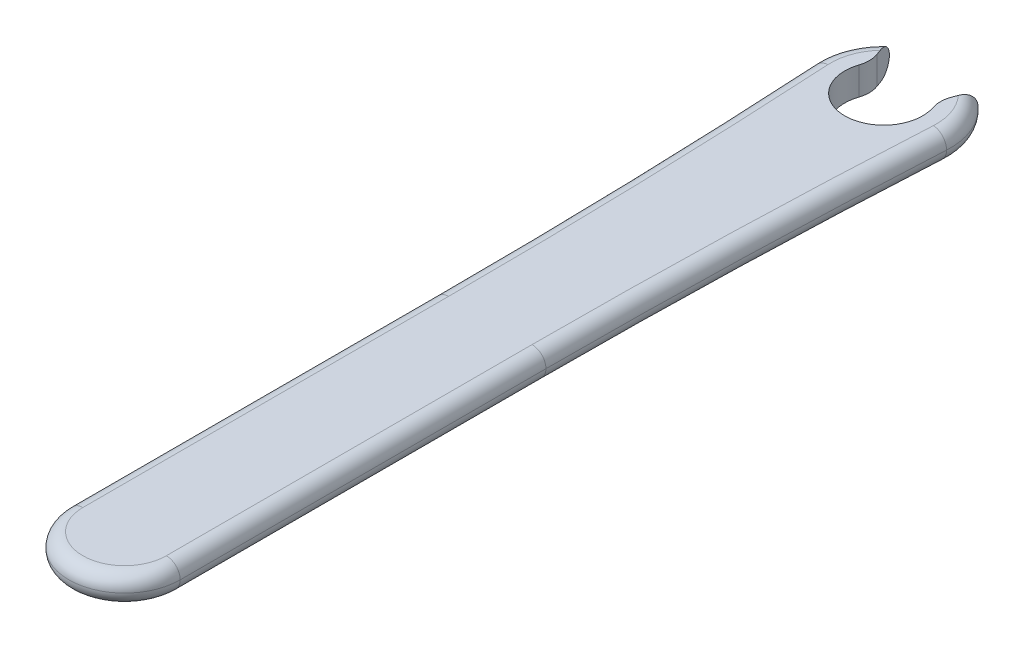
ISO-10303-21;
HEADER;
FILE_DESCRIPTION(('STEP AP214'),'2;1');
FILE_NAME('part.step','',(''),(''),'','','');
FILE_SCHEMA(('AUTOMOTIVE_DESIGN { 1 0 10303 214 1 1 1 1 }'));
ENDSEC;
DATA;
#1=APPLICATION_CONTEXT('core data for automotive mechanical design processes');
#2=APPLICATION_PROTOCOL_DEFINITION('international standard','automotive_design',2000,#1);
#3=PRODUCT_CONTEXT('',#1,'mechanical');
#4=PRODUCT('Part','Part','',(#3));
#5=PRODUCT_RELATED_PRODUCT_CATEGORY('part','',(#4));
#6=PRODUCT_DEFINITION_FORMATION('','',#4);
#7=PRODUCT_DEFINITION_CONTEXT('part definition',#1,'design');
#8=PRODUCT_DEFINITION('design','',#6,#7);
#9=PRODUCT_DEFINITION_SHAPE('','',#8);
#10=(LENGTH_UNIT() NAMED_UNIT(*) SI_UNIT(.MILLI.,.METRE.));
#11=(NAMED_UNIT(*) PLANE_ANGLE_UNIT() SI_UNIT($,.RADIAN.));
#12=(NAMED_UNIT(*) SI_UNIT($,.STERADIAN.) SOLID_ANGLE_UNIT());
#13=UNCERTAINTY_MEASURE_WITH_UNIT(LENGTH_MEASURE(1.E-05),#10,'distance_accuracy_value','');
#14=(GEOMETRIC_REPRESENTATION_CONTEXT(3) GLOBAL_UNCERTAINTY_ASSIGNED_CONTEXT((#13)) GLOBAL_UNIT_ASSIGNED_CONTEXT((#10,
#11,#12)) REPRESENTATION_CONTEXT('',''));
#15=CARTESIAN_POINT('',(0.,0.,0.));
#16=DIRECTION('',(0.,0.,1.));
#17=DIRECTION('',(1.,0.,0.));
#18=AXIS2_PLACEMENT_3D('',#15,#16,#17);
#19=CARTESIAN_POINT('',(-39.696999348701,5.,-14.4485261526121));
#20=DIRECTION('',(-0.939692620785908,0.,-0.34202014332567));
#21=DIRECTION('',(-0.34202014332567,0.,0.939692620785908));
#22=AXIS2_PLACEMENT_3D('',#19,#20,#21);
#23=PLANE('',#22);
#24=DIRECTION('',(0.34202014332567,0.,-0.939692620785908));
#25=VECTOR('',#24,1.);
#26=CARTESIAN_POINT('',(-39.696999348701,0.,-14.4485261526121));
#27=LINE('',#26,#25);
#28=CARTESIAN_POINT('',(6.68838596375788,0.,-141.891324891294));
#29=VERTEX_POINT('',#28);
#30=CARTESIAN_POINT('',(7.01811954357422,0.,-142.797260456276));
#31=VERTEX_POINT('',#30);
#32=EDGE_CURVE('E155',#29,#31,#27,.T.);
#33=ORIENTED_EDGE('',*,*,#32,.F.);
#34=DIRECTION('',(0.,-1.,0.));
#35=VECTOR('',#34,1.);
#36=CARTESIAN_POINT('',(6.68838596375787,5.,-141.891324891294));
#37=LINE('',#36,#35);
#38=CARTESIAN_POINT('',(6.68838596375788,5.,-141.891324891294));
#39=VERTEX_POINT('',#38);
#40=EDGE_CURVE('E64',#29,#39,#37,.F.);
#41=ORIENTED_EDGE('',*,*,#40,.T.);
#42=DIRECTION('',(0.34202014332567,0.,-0.939692620785908));
#43=VECTOR('',#42,1.);
#44=CARTESIAN_POINT('',(-39.696999348701,5.,-14.4485261526121));
#45=LINE('',#44,#43);
#46=CARTESIAN_POINT('',(7.01811954357422,5.,-142.797260456276));
#47=VERTEX_POINT('',#46);
#48=EDGE_CURVE('E318',#39,#47,#45,.T.);
#49=ORIENTED_EDGE('',*,*,#48,.T.);
#50=CARTESIAN_POINT('',(7.01811954357419,5.,-142.797260456276));
#51=CARTESIAN_POINT('',(7.04691442228125,4.99999569487418,-142.876373735319));
#52=CARTESIAN_POINT('',(7.07569893168847,4.99665912763034,-142.955458524946));
#53=CARTESIAN_POINT('',(7.13309334301084,4.98319356858276,-143.113148374057));
#54=CARTESIAN_POINT('',(7.16170316351006,4.97306162219831,-143.191753209853));
#55=CARTESIAN_POINT('',(7.24717008681841,4.93220456844502,-143.426571651753));
#56=CARTESIAN_POINT('',(7.30349226458079,4.89101665324073,-143.581315563369));
#57=CARTESIAN_POINT('',(7.41298594618291,4.78041147476569,-143.882146981144));
#58=CARTESIAN_POINT('',(7.46614759123599,4.71091069773193,-144.028207400509));
#59=CARTESIAN_POINT('',(7.56712675796152,4.54453843727452,-144.305645380922));
#60=CARTESIAN_POINT('',(7.61495425092782,4.44771925946431,-144.437050337876));
#61=CARTESIAN_POINT('',(7.69958654783228,4.23806297979748,-144.669575662578));
#62=CARTESIAN_POINT('',(7.73698018128248,4.12725881240472,-144.772313826114));
#63=CARTESIAN_POINT('',(7.80413600309858,3.88724046736428,-144.956822930138));
#64=CARTESIAN_POINT('',(7.83389778084395,3.758025299722,-145.038592742457));
#65=CARTESIAN_POINT('',(7.88218130864503,3.49743648708916,-145.171250644822));
#66=CARTESIAN_POINT('',(7.90146398906665,3.3672629391275,-145.224229373867));
#67=CARTESIAN_POINT('',(7.93174599027238,3.09904379413317,-145.307428488395));
#68=CARTESIAN_POINT('',(7.94276063746545,2.9610132752856,-145.337690982842));
#69=CARTESIAN_POINT('',(7.9519631461084,2.76811862292543,-145.36297466754));
#70=CARTESIAN_POINT('',(7.95387094574782,2.71460329032933,-145.368216303971));
#71=CARTESIAN_POINT('',(7.95641294171998,2.60740099332147,-145.375200380504));
#72=CARTESIAN_POINT('',(7.95704917916841,2.5537144427497,-145.376948428527));
#73=CARTESIAN_POINT('',(7.95705021219238,2.50000000000004,-145.376951266737));
#74=B_SPLINE_CURVE_WITH_KNOTS('',3,(#50,#51,#52,#53,#54,#55,#56,#57,#58,#59,#60,#61,#62,#63,#64,
#65,#66,#67,#68,#69,#70,#71,#72,#73),.UNSPECIFIED.,.F.,.F.,(4,2,2,2,2,2,2,2,2,2,2,4),(0.,
0.252438653894688,0.504987137469356,1.01157805277916,1.51967419323459,2.02680402485596,
2.4912678586387,2.9557566769597,3.37919345375437,3.80184335642917,3.96315812857803,
4.12421374908903),.UNSPECIFIED.);
#75=CARTESIAN_POINT('',(7.95705021219229,2.5,-145.376951266737));
#76=VERTEX_POINT('',#75);
#77=EDGE_CURVE('E168',#47,#76,#74,.T.);
#78=ORIENTED_EDGE('',*,*,#77,.T.);
#79=CARTESIAN_POINT('',(7.95705021219229,2.5,-145.376951266737));
#80=CARTESIAN_POINT('',(7.9570533103432,2.43345665852213,-145.376959778837));
#81=CARTESIAN_POINT('',(7.95607338441053,2.36691766148827,-145.374267454464));
#82=CARTESIAN_POINT('',(7.95217128845519,2.23433878829222,-145.363546533938));
#83=CARTESIAN_POINT('',(7.94924943331622,2.16829883296598,-145.355518802921));
#84=CARTESIAN_POINT('',(7.94149655558822,2.03734345523818,-145.334217946428));
#85=CARTESIAN_POINT('',(7.93667011807542,1.97242572012709,-145.320957418345));
#86=CARTESIAN_POINT('',(7.92515883166769,1.84403263747157,-145.289330418871));
#87=CARTESIAN_POINT('',(7.91847396602208,1.7805573029336,-145.270963901457));
#88=CARTESIAN_POINT('',(7.89571655259378,1.59297083259672,-145.208438421938));
#89=CARTESIAN_POINT('',(7.87693344901036,1.47157016191326,-145.156832268975));
#90=CARTESIAN_POINT('',(7.83283035507492,1.23946394539727,-145.035660014259));
#91=CARTESIAN_POINT('',(7.80750843467638,1.12876157063528,-144.966088609747));
#92=CARTESIAN_POINT('',(7.75047687198446,0.917999599725764,-144.809395679055));
#93=CARTESIAN_POINT('',(7.71862610363177,0.818266658905984,-144.721886412214));
#94=CARTESIAN_POINT('',(7.6499700954092,0.634711468903092,-144.533255579912));
#95=CARTESIAN_POINT('',(7.61316438482801,0.550890733178659,-144.432132721183));
#96=CARTESIAN_POINT('',(7.53311335453101,0.395559375438975,-144.212194323038));
#97=CARTESIAN_POINT('',(7.48960431995705,0.325212182545565,-144.092654233004));
#98=CARTESIAN_POINT('',(7.39938457619261,0.204885266884529,-143.844777524222));
#99=CARTESIAN_POINT('',(7.35267087503518,0.154924888629373,-143.716432685113));
#100=CARTESIAN_POINT('',(7.25832336810969,0.0765469630457412,-143.457215040253));
#101=CARTESIAN_POINT('',(7.21073457241573,0.0476658042627298,-143.326465898665));
#102=CARTESIAN_POINT('',(7.13876683452261,0.0189656723391909,-143.128736163875));
#103=CARTESIAN_POINT('',(7.11470134648222,0.0118357607807873,-143.062616778896));
#104=CARTESIAN_POINT('',(7.06646580784185,0.00235445068809157,-142.930090725666));
#105=CARTESIAN_POINT('',(7.04229578303531,1.93403959648804E-06,-142.863684128282));
#106=CARTESIAN_POINT('',(7.0181195435742,0.,-142.797260456276));
#107=B_SPLINE_CURVE_WITH_KNOTS('',3,(#79,#80,#81,#82,#83,#84,#85,#86,#87,#88,#89,#90,#91,#92,
#93,#94,#95,#96,#97,#98,#99,#100,#101,#102,#103,#104,#105,#106),.UNSPECIFIED.,.F.,.F.,(4,2,2,2,
2,2,2,2,2,2,2,2,2,4),(0.,0.19956086314104,0.399089375392354,0.598140446346242,0.797193311476509,
1.19491090210467,1.59274602051257,2.00031467964391,2.40792208448062,2.84218408853627,
3.27685719954437,3.70165571470379,3.91368650407941,4.12566766348372),.UNSPECIFIED.);
#108=EDGE_CURVE('E166',#76,#31,#107,.T.);
#109=ORIENTED_EDGE('',*,*,#108,.T.);
#110=EDGE_LOOP('',(#33,#41,#49,#78,#109));
#111=FACE_BOUND('',#110,.T.);
#112=ADVANCED_FACE('F41',(#111),#23,.T.);
#113=CARTESIAN_POINT('',(0.,5.,-136.394448724536));
#114=DIRECTION('',(0.,-1.,0.));
#115=DIRECTION('',(0.,0.,-1.));
#116=AXIS2_PLACEMENT_3D('',#113,#114,#115);
#117=CYLINDRICAL_SURFACE('',#116,7.);
#118=CARTESIAN_POINT('',(0.,5.,-136.394448724536));
#119=DIRECTION('',(0.,1.,0.));
#120=DIRECTION('',(0.,0.,1.));
#121=AXIS2_PLACEMENT_3D('',#118,#119,#120);
#122=CIRCLE('',#121,7.);
#123=CARTESIAN_POINT('',(-6.64232862281765,5.,-138.603401070445));
#124=VERTEX_POINT('',#123);
#125=CARTESIAN_POINT('',(6.64232862281765,5.,-138.603401070445));
#126=VERTEX_POINT('',#125);
#127=EDGE_CURVE('E317',#124,#126,#122,.T.);
#128=ORIENTED_EDGE('',*,*,#127,.T.);
#129=DIRECTION('',(0.,-1.,0.));
#130=VECTOR('',#129,1.);
#131=CARTESIAN_POINT('',(6.64232862281765,5.,-138.603401070445));
#132=LINE('',#131,#130);
#133=CARTESIAN_POINT('',(6.64232862281765,0.,-138.603401070445));
#134=VERTEX_POINT('',#133);
#135=EDGE_CURVE('E308',#126,#134,#132,.T.);
#136=ORIENTED_EDGE('',*,*,#135,.T.);
#137=CARTESIAN_POINT('',(0.,0.,-136.394448724536));
#138=DIRECTION('',(0.,1.,0.));
#139=DIRECTION('',(0.,0.,1.));
#140=AXIS2_PLACEMENT_3D('',#137,#138,#139);
#141=CIRCLE('',#140,7.);
#142=CARTESIAN_POINT('',(-6.64232862281765,0.,-138.603401070445));
#143=VERTEX_POINT('',#142);
#144=EDGE_CURVE('E162',#143,#134,#141,.T.);
#145=ORIENTED_EDGE('',*,*,#144,.F.);
#146=DIRECTION('',(0.,-1.,0.));
#147=VECTOR('',#146,1.);
#148=CARTESIAN_POINT('',(-6.64232862281765,5.,-138.603401070445));
#149=LINE('',#148,#147);
#150=EDGE_CURVE('E306',#143,#124,#149,.F.);
#151=ORIENTED_EDGE('',*,*,#150,.T.);
#152=EDGE_LOOP('',(#128,#136,#145,#151));
#153=FACE_BOUND('',#152,.T.);
#154=ADVANCED_FACE('F223',(#153),#117,.F.);
#155=CARTESIAN_POINT('',(39.696999348701,5.,-14.448526152612));
#156=DIRECTION('',(-0.939692620785908,0.,0.34202014332567));
#157=DIRECTION('',(0.34202014332567,0.,0.939692620785908));
#158=AXIS2_PLACEMENT_3D('',#155,#156,#157);
#159=PLANE('',#158);
#160=DIRECTION('',(-0.34202014332567,0.,-0.939692620785908));
#161=VECTOR('',#160,1.);
#162=CARTESIAN_POINT('',(39.696999348701,5.,-14.448526152612));
#163=LINE('',#162,#161);
#164=CARTESIAN_POINT('',(-6.68838596375788,5.,-141.891324891294));
#165=VERTEX_POINT('',#164);
#166=CARTESIAN_POINT('',(-7.0181195435742,5.,-142.797260456276));
#167=VERTEX_POINT('',#166);
#168=EDGE_CURVE('E323',#165,#167,#163,.T.);
#169=ORIENTED_EDGE('',*,*,#168,.F.);
#170=DIRECTION('',(0.,1.,0.));
#171=VECTOR('',#170,1.);
#172=CARTESIAN_POINT('',(-6.68838596375787,0.,-141.891324891294));
#173=LINE('',#172,#171);
#174=CARTESIAN_POINT('',(-6.68838596375788,0.,-141.891324891294));
#175=VERTEX_POINT('',#174);
#176=EDGE_CURVE('E11',#165,#175,#173,.F.);
#177=ORIENTED_EDGE('',*,*,#176,.T.);
#178=DIRECTION('',(-0.34202014332567,0.,-0.939692620785908));
#179=VECTOR('',#178,1.);
#180=CARTESIAN_POINT('',(39.696999348701,0.,-14.448526152612));
#181=LINE('',#180,#179);
#182=CARTESIAN_POINT('',(-7.0181195435742,0.,-142.797260456276));
#183=VERTEX_POINT('',#182);
#184=EDGE_CURVE('E391',#175,#183,#181,.T.);
#185=ORIENTED_EDGE('',*,*,#184,.T.);
#186=CARTESIAN_POINT('',(-7.01811954357421,0.,-142.797260456276));
#187=CARTESIAN_POINT('',(-7.04691442228126,4.30512581740736E-06,-142.876373735319));
#188=CARTESIAN_POINT('',(-7.07569893168848,0.00334087236966369,-142.955458524945));
#189=CARTESIAN_POINT('',(-7.13309334301084,0.0168064314172379,-143.113148374057));
#190=CARTESIAN_POINT('',(-7.16170316351006,0.0269383778016891,-143.191753209853));
#191=CARTESIAN_POINT('',(-7.24717008681841,0.067795431554977,-143.426571651753));
#192=CARTESIAN_POINT('',(-7.30349226458079,0.108983346759271,-143.581315563369));
#193=CARTESIAN_POINT('',(-7.41298594618292,0.219588525234315,-143.882146981144));
#194=CARTESIAN_POINT('',(-7.46614759123599,0.289089302268081,-144.028207400509));
#195=CARTESIAN_POINT('',(-7.56712675796153,0.455461562725495,-144.305645380922));
#196=CARTESIAN_POINT('',(-7.61495425092784,0.552280740535714,-144.437050337876));
#197=CARTESIAN_POINT('',(-7.6995865478323,0.761937020202538,-144.669575662578));
#198=CARTESIAN_POINT('',(-7.7369801812825,0.872741187595296,-144.772313826114));
#199=CARTESIAN_POINT('',(-7.80413600309859,1.11275953263573,-144.956822930138));
#200=CARTESIAN_POINT('',(-7.83389778084396,1.24197470027801,-145.038592742457));
#201=CARTESIAN_POINT('',(-7.88218130864504,1.50256351291085,-145.171250644822));
#202=CARTESIAN_POINT('',(-7.90146398906665,1.63273706087251,-145.224229373867));
#203=CARTESIAN_POINT('',(-7.93174599027238,1.90095620586684,-145.307428488395));
#204=CARTESIAN_POINT('',(-7.94276063746545,2.03898672471442,-145.337690982842));
#205=CARTESIAN_POINT('',(-7.9519631461084,2.23188137707459,-145.36297466754));
#206=CARTESIAN_POINT('',(-7.95387094574783,2.28539670967068,-145.368216303971));
#207=CARTESIAN_POINT('',(-7.95641294171998,2.39259900667853,-145.375200380504));
#208=CARTESIAN_POINT('',(-7.95704917916842,2.44628555725031,-145.376948428527));
#209=CARTESIAN_POINT('',(-7.95705021219238,2.49999999999996,-145.376951266737));
#210=B_SPLINE_CURVE_WITH_KNOTS('',3,(#186,#187,#188,#189,#190,#191,#192,#193,#194,#195,#196,
#197,#198,#199,#200,#201,#202,#203,#204,#205,#206,#207,#208,#209),.UNSPECIFIED.,.F.,.F.,(4,2,2,
2,2,2,2,2,2,2,2,4),(0.,0.252438653894712,0.504987137469376,1.01157805277918,1.51967419323464,
2.02680402485602,2.49126785863876,2.95575667695974,3.3791934537544,3.80184335642921,
3.96315812857806,4.12421374908906),.UNSPECIFIED.);
#211=CARTESIAN_POINT('',(-7.95705021219229,2.5,-145.376951266737));
#212=VERTEX_POINT('',#211);
#213=EDGE_CURVE('E208',#183,#212,#210,.T.);
#214=ORIENTED_EDGE('',*,*,#213,.T.);
#215=CARTESIAN_POINT('',(-7.95705021219229,2.5,-145.376951266737));
#216=CARTESIAN_POINT('',(-7.9570533103432,2.56654334147787,-145.376959778837));
#217=CARTESIAN_POINT('',(-7.95607338441053,2.63308233851173,-145.374267454464));
#218=CARTESIAN_POINT('',(-7.95217128845519,2.76566121170779,-145.363546533938));
#219=CARTESIAN_POINT('',(-7.94924943331623,2.83170116703403,-145.355518802921));
#220=CARTESIAN_POINT('',(-7.94149655558822,2.96265654476182,-145.334217946428));
#221=CARTESIAN_POINT('',(-7.93667011807543,3.02757427987292,-145.320957418345));
#222=CARTESIAN_POINT('',(-7.9251588316677,3.15596736252843,-145.289330418871));
#223=CARTESIAN_POINT('',(-7.91847396602209,3.2194426970664,-145.270963901457));
#224=CARTESIAN_POINT('',(-7.89571655259379,3.40702916740328,-145.208438421938));
#225=CARTESIAN_POINT('',(-7.87693344901036,3.52842983808674,-145.156832268975));
#226=CARTESIAN_POINT('',(-7.83283035507491,3.76053605460274,-145.035660014259));
#227=CARTESIAN_POINT('',(-7.80750843467638,3.87123842936473,-144.966088609747));
#228=CARTESIAN_POINT('',(-7.75047687198446,4.08200040027424,-144.809395679055));
#229=CARTESIAN_POINT('',(-7.71862610363177,4.18173334109402,-144.721886412214));
#230=CARTESIAN_POINT('',(-7.6499700954092,4.36528853109692,-144.533255579912));
#231=CARTESIAN_POINT('',(-7.61316438482802,4.44910926682135,-144.432132721183));
#232=CARTESIAN_POINT('',(-7.53311335453101,4.60444062456104,-144.212194323038));
#233=CARTESIAN_POINT('',(-7.48960431995705,4.67478781745445,-144.092654233004));
#234=CARTESIAN_POINT('',(-7.3993845761926,4.79511473311548,-143.844777524222));
#235=CARTESIAN_POINT('',(-7.35267087503517,4.84507511137064,-143.716432685113));
#236=CARTESIAN_POINT('',(-7.2583233681097,4.92345303695426,-143.457215040253));
#237=CARTESIAN_POINT('',(-7.21073457241574,4.95233419573727,-143.326465898665));
#238=CARTESIAN_POINT('',(-7.13876683452263,4.98103432766081,-143.128736163875));
#239=CARTESIAN_POINT('',(-7.11470134648224,4.98816423921921,-143.062616778896));
#240=CARTESIAN_POINT('',(-7.06646580784186,4.99764554931191,-142.930090725666));
#241=CARTESIAN_POINT('',(-7.04229578303532,4.9999980659604,-142.863684128282));
#242=CARTESIAN_POINT('',(-7.0181195435742,5.,-142.797260456276));
#243=B_SPLINE_CURVE_WITH_KNOTS('',3,(#215,#216,#217,#218,#219,#220,#221,#222,#223,#224,#225,
#226,#227,#228,#229,#230,#231,#232,#233,#234,#235,#236,#237,#238,#239,#240,#241,#242),
.UNSPECIFIED.,.F.,.F.,(4,2,2,2,2,2,2,2,2,2,2,2,2,4),(0.,0.199560863141044,0.399089375392356,
0.598140446346253,0.797193311476515,1.19491090210467,1.59274602051258,2.00031467964392,
2.40792208448065,2.84218408853633,3.27685719954439,3.70165571470378,3.9136865040794,
4.12566766348374),.UNSPECIFIED.);
#244=EDGE_CURVE('E199',#212,#167,#243,.T.);
#245=ORIENTED_EDGE('',*,*,#244,.T.);
#246=EDGE_LOOP('',(#169,#177,#185,#214,#245));
#247=FACE_BOUND('',#246,.T.);
#248=ADVANCED_FACE('F217',(#247),#159,.F.);
#249=CARTESIAN_POINT('',(0.,5.,0.));
#250=DIRECTION('',(0.,1.,0.));
#251=DIRECTION('',(0.,0.,1.));
#252=AXIS2_PLACEMENT_3D('',#249,#250,#251);
#253=PLANE('',#252);
#254=ORIENTED_EDGE('',*,*,#48,.F.);
#255=CARTESIAN_POINT('',(11.3868490676874,5.,-140.181224174666));
#256=DIRECTION('',(0.,1.,0.));
#257=DIRECTION('',(0.,0.,1.));
#258=AXIS2_PLACEMENT_3D('',#255,#256,#257);
#259=CIRCLE('',#258,5.);
#260=EDGE_CURVE('E49',#39,#126,#259,.T.);
#261=ORIENTED_EDGE('',*,*,#260,.T.);
#262=ORIENTED_EDGE('',*,*,#127,.F.);
#263=CARTESIAN_POINT('',(-11.3868490676874,5.,-140.181224174666));
#264=DIRECTION('',(0.,1.,0.));
#265=DIRECTION('',(0.,0.,1.));
#266=AXIS2_PLACEMENT_3D('',#263,#264,#265);
#267=CIRCLE('',#266,5.);
#268=EDGE_CURVE('E56',#124,#165,#267,.T.);
#269=ORIENTED_EDGE('',*,*,#268,.T.);
#270=ORIENTED_EDGE('',*,*,#168,.T.);
#271=CARTESIAN_POINT('',(0.,5.,-136.394448724536));
#272=DIRECTION('',(0.,1.,0.));
#273=DIRECTION('',(0.,0.,1.));
#274=AXIS2_PLACEMENT_3D('',#271,#272,#273);
#275=CIRCLE('',#274,9.5);
#276=CARTESIAN_POINT('',(-9.48479836646574,5.,-135.857233732667));
#277=VERTEX_POINT('',#276);
#278=EDGE_CURVE('E178',#167,#277,#275,.T.);
#279=ORIENTED_EDGE('',*,*,#278,.T.);
#280=CARTESIAN_POINT('',(-1247.865677736,5.,-65.7158613663855));
#281=DIRECTION('',(0.,1.,0.));
#282=DIRECTION('',(0.,0.,1.));
#283=AXIS2_PLACEMENT_3D('',#280,#281,#282);
#284=CIRCLE('',#283,1240.365677736);
#285=CARTESIAN_POINT('',(-7.50000000000001,5.,-65.7158613663855));
#286=VERTEX_POINT('',#285);
#287=EDGE_CURVE('E181',#277,#286,#284,.F.);
#288=ORIENTED_EDGE('',*,*,#287,.T.);
#289=DIRECTION('',(0.,0.,1.));
#290=VECTOR('',#289,1.);
#291=CARTESIAN_POINT('',(-7.5,5.,0.));
#292=LINE('',#291,#290);
#293=CARTESIAN_POINT('',(-7.5,5.,0.));
#294=VERTEX_POINT('',#293);
#295=EDGE_CURVE('E188',#286,#294,#292,.T.);
#296=ORIENTED_EDGE('',*,*,#295,.T.);
#297=CARTESIAN_POINT('',(0.,5.,0.));
#298=DIRECTION('',(0.,1.,0.));
#299=DIRECTION('',(0.,0.,1.));
#300=AXIS2_PLACEMENT_3D('',#297,#298,#299);
#301=CIRCLE('',#300,7.49999999999999);
#302=CARTESIAN_POINT('',(7.49999999999999,5.,0.));
#303=VERTEX_POINT('',#302);
#304=EDGE_CURVE('E190',#294,#303,#301,.T.);
#305=ORIENTED_EDGE('',*,*,#304,.T.);
#306=DIRECTION('',(0.,0.,1.));
#307=VECTOR('',#306,1.);
#308=CARTESIAN_POINT('',(7.49999999999999,5.,0.));
#309=LINE('',#308,#307);
#310=CARTESIAN_POINT('',(7.50000000000001,5.,-65.7158613663855));
#311=VERTEX_POINT('',#310);
#312=EDGE_CURVE('E192',#303,#311,#309,.F.);
#313=ORIENTED_EDGE('',*,*,#312,.T.);
#314=CARTESIAN_POINT('',(1247.865677736,5.,-65.7158613663855));
#315=DIRECTION('',(0.,1.,0.));
#316=DIRECTION('',(0.,0.,1.));
#317=AXIS2_PLACEMENT_3D('',#314,#315,#316);
#318=CIRCLE('',#317,1240.365677736);
#319=CARTESIAN_POINT('',(9.48479836646574,5.,-135.857233732667));
#320=VERTEX_POINT('',#319);
#321=EDGE_CURVE('E194',#311,#320,#318,.F.);
#322=ORIENTED_EDGE('',*,*,#321,.T.);
#323=CARTESIAN_POINT('',(0.,5.,-136.394448724536));
#324=DIRECTION('',(0.,1.,0.));
#325=DIRECTION('',(0.,0.,1.));
#326=AXIS2_PLACEMENT_3D('',#323,#324,#325);
#327=CIRCLE('',#326,9.5);
#328=EDGE_CURVE('E196',#320,#47,#327,.T.);
#329=ORIENTED_EDGE('',*,*,#328,.T.);
#330=EDGE_LOOP('',(#254,#261,#262,#269,#270,#279,#288,#296,#305,#313,#322,#329));
#331=FACE_BOUND('',#330,.T.);
#332=ADVANCED_FACE('F222',(#331),#253,.T.);
#333=CARTESIAN_POINT('',(0.,0.,0.));
#334=DIRECTION('',(0.,1.,0.));
#335=DIRECTION('',(0.,0.,1.));
#336=AXIS2_PLACEMENT_3D('',#333,#334,#335);
#337=PLANE('',#336);
#338=ORIENTED_EDGE('',*,*,#144,.T.);
#339=CARTESIAN_POINT('',(11.3868490676874,0.,-140.181224174666));
#340=DIRECTION('',(0.,1.,0.));
#341=DIRECTION('',(0.,0.,1.));
#342=AXIS2_PLACEMENT_3D('',#339,#340,#341);
#343=CIRCLE('',#342,5.);
#344=EDGE_CURVE('E161',#134,#29,#343,.F.);
#345=ORIENTED_EDGE('',*,*,#344,.T.);
#346=ORIENTED_EDGE('',*,*,#32,.T.);
#347=CARTESIAN_POINT('',(0.,0.,-136.394448724536));
#348=DIRECTION('',(0.,1.,0.));
#349=DIRECTION('',(0.,0.,1.));
#350=AXIS2_PLACEMENT_3D('',#347,#348,#349);
#351=CIRCLE('',#350,9.5);
#352=CARTESIAN_POINT('',(9.48479836646574,0.,-135.857233732667));
#353=VERTEX_POINT('',#352);
#354=EDGE_CURVE('E160',#31,#353,#351,.F.);
#355=ORIENTED_EDGE('',*,*,#354,.T.);
#356=CARTESIAN_POINT('',(1247.865677736,0.,-65.7158613663855));
#357=DIRECTION('',(0.,1.,0.));
#358=DIRECTION('',(0.,0.,1.));
#359=AXIS2_PLACEMENT_3D('',#356,#357,#358);
#360=CIRCLE('',#359,1240.365677736);
#361=CARTESIAN_POINT('',(7.50000000000001,0.,-65.7158613663855));
#362=VERTEX_POINT('',#361);
#363=EDGE_CURVE('E179',#353,#362,#360,.T.);
#364=ORIENTED_EDGE('',*,*,#363,.T.);
#365=DIRECTION('',(0.,0.,1.));
#366=VECTOR('',#365,1.);
#367=CARTESIAN_POINT('',(7.49999999999999,0.,0.));
#368=LINE('',#367,#366);
#369=CARTESIAN_POINT('',(7.49999999999999,0.,0.));
#370=VERTEX_POINT('',#369);
#371=EDGE_CURVE('E183',#362,#370,#368,.T.);
#372=ORIENTED_EDGE('',*,*,#371,.T.);
#373=CARTESIAN_POINT('',(0.,0.,0.));
#374=DIRECTION('',(0.,1.,0.));
#375=DIRECTION('',(0.,0.,1.));
#376=AXIS2_PLACEMENT_3D('',#373,#374,#375);
#377=CIRCLE('',#376,7.49999999999999);
#378=CARTESIAN_POINT('',(-7.5,0.,0.));
#379=VERTEX_POINT('',#378);
#380=EDGE_CURVE('E253',#370,#379,#377,.F.);
#381=ORIENTED_EDGE('',*,*,#380,.T.);
#382=DIRECTION('',(0.,0.,1.));
#383=VECTOR('',#382,1.);
#384=CARTESIAN_POINT('',(-7.5,0.,0.));
#385=LINE('',#384,#383);
#386=CARTESIAN_POINT('',(-7.50000000000001,0.,-65.7158613663855));
#387=VERTEX_POINT('',#386);
#388=EDGE_CURVE('E251',#379,#387,#385,.F.);
#389=ORIENTED_EDGE('',*,*,#388,.T.);
#390=CARTESIAN_POINT('',(-1247.865677736,0.,-65.7158613663855));
#391=DIRECTION('',(0.,1.,0.));
#392=DIRECTION('',(0.,0.,1.));
#393=AXIS2_PLACEMENT_3D('',#390,#391,#392);
#394=CIRCLE('',#393,1240.365677736);
#395=CARTESIAN_POINT('',(-9.48479836646574,0.,-135.857233732667));
#396=VERTEX_POINT('',#395);
#397=EDGE_CURVE('E249',#387,#396,#394,.T.);
#398=ORIENTED_EDGE('',*,*,#397,.T.);
#399=CARTESIAN_POINT('',(0.,0.,-136.394448724536));
#400=DIRECTION('',(0.,1.,0.));
#401=DIRECTION('',(0.,0.,1.));
#402=AXIS2_PLACEMENT_3D('',#399,#400,#401);
#403=CIRCLE('',#402,9.5);
#404=EDGE_CURVE('E172',#396,#183,#403,.F.);
#405=ORIENTED_EDGE('',*,*,#404,.T.);
#406=ORIENTED_EDGE('',*,*,#184,.F.);
#407=CARTESIAN_POINT('',(-11.3868490676874,0.,-140.181224174666));
#408=DIRECTION('',(0.,1.,0.));
#409=DIRECTION('',(0.,0.,1.));
#410=AXIS2_PLACEMENT_3D('',#407,#408,#409);
#411=CIRCLE('',#410,5.);
#412=EDGE_CURVE('E311',#175,#143,#411,.F.);
#413=ORIENTED_EDGE('',*,*,#412,.T.);
#414=EDGE_LOOP('',(#338,#345,#346,#355,#364,#372,#381,#389,#398,#405,#406,#413));
#415=FACE_BOUND('',#414,.T.);
#416=ADVANCED_FACE('F158',(#415),#337,.F.);
#417=CARTESIAN_POINT('',(0.,2.5,-136.394448724536));
#418=DIRECTION('',(0.,1.,0.));
#419=DIRECTION('',(0.,0.,1.));
#420=AXIS2_PLACEMENT_3D('',#417,#418,#419);
#421=TOROIDAL_SURFACE('',#420,9.5,2.5);
#422=ORIENTED_EDGE('',*,*,#278,.F.);
#423=ORIENTED_EDGE('',*,*,#244,.F.);
#424=CARTESIAN_POINT('',(0.,2.5,-136.394448724536));
#425=DIRECTION('',(0.,1.,0.));
#426=DIRECTION('',(0.,0.,1.));
#427=AXIS2_PLACEMENT_3D('',#424,#425,#426);
#428=CIRCLE('',#427,12.);
#429=CARTESIAN_POINT('',(-11.9807979365883,2.5,-135.715861366386));
#430=VERTEX_POINT('',#429);
#431=EDGE_CURVE('E163',#430,#212,#428,.F.);
#432=ORIENTED_EDGE('',*,*,#431,.F.);
#433=CARTESIAN_POINT('',(-9.48479836646574,2.5,-135.857233732667));
#434=DIRECTION('',(0.0565489465125357,0.,0.998399828049025));
#435=DIRECTION('',(0.998399828049025,0.,-0.0565489465125357));
#436=AXIS2_PLACEMENT_3D('',#433,#434,#435);
#437=CIRCLE('',#436,2.5);
#438=EDGE_CURVE('E301',#277,#430,#437,.T.);
#439=ORIENTED_EDGE('',*,*,#438,.F.);
#440=EDGE_LOOP('',(#422,#423,#432,#439));
#441=FACE_BOUND('',#440,.T.);
#442=ADVANCED_FACE('F215',(#441),#421,.T.);
#443=CARTESIAN_POINT('',(0.,2.5,-136.394448724536));
#444=DIRECTION('',(0.,1.,0.));
#445=DIRECTION('',(0.,0.,1.));
#446=AXIS2_PLACEMENT_3D('',#443,#444,#445);
#447=TOROIDAL_SURFACE('',#446,9.5,2.5);
#448=ORIENTED_EDGE('',*,*,#213,.F.);
#449=ORIENTED_EDGE('',*,*,#404,.F.);
#450=CARTESIAN_POINT('',(-9.48479836646574,2.5,-135.857233732667));
#451=DIRECTION('',(0.0565489465125357,0.,0.998399828049025));
#452=DIRECTION('',(0.998399828049025,0.,-0.0565489465125357));
#453=AXIS2_PLACEMENT_3D('',#450,#451,#452);
#454=CIRCLE('',#453,2.5);
#455=EDGE_CURVE('E298',#430,#396,#454,.T.);
#456=ORIENTED_EDGE('',*,*,#455,.F.);
#457=ORIENTED_EDGE('',*,*,#431,.T.);
#458=EDGE_LOOP('',(#448,#449,#456,#457));
#459=FACE_BOUND('',#458,.T.);
#460=ADVANCED_FACE('F376',(#459),#447,.T.);
#461=CARTESIAN_POINT('',(-1247.865677736,2.5,-65.7158613663855));
#462=DIRECTION('',(0.,1.,0.));
#463=DIRECTION('',(0.,0.,1.));
#464=AXIS2_PLACEMENT_3D('',#461,#462,#463);
#465=TOROIDAL_SURFACE('',#464,1240.365677736,2.5);
#466=ORIENTED_EDGE('',*,*,#287,.F.);
#467=ORIENTED_EDGE('',*,*,#438,.T.);
#468=CARTESIAN_POINT('',(-1247.865677736,2.5,-65.7158613663855));
#469=DIRECTION('',(0.,1.,0.));
#470=DIRECTION('',(0.,0.,1.));
#471=AXIS2_PLACEMENT_3D('',#468,#469,#470);
#472=CIRCLE('',#471,1237.865677736);
#473=CARTESIAN_POINT('',(-10.,2.5,-65.7158613663855));
#474=VERTEX_POINT('',#473);
#475=EDGE_CURVE('E295',#474,#430,#472,.T.);
#476=ORIENTED_EDGE('',*,*,#475,.F.);
#477=CARTESIAN_POINT('',(-7.50000000000001,2.5,-65.7158613663855));
#478=DIRECTION('',(0.,0.,1.));
#479=DIRECTION('',(1.,0.,0.));
#480=AXIS2_PLACEMENT_3D('',#477,#478,#479);
#481=CIRCLE('',#480,2.5);
#482=EDGE_CURVE('E292',#286,#474,#481,.T.);
#483=ORIENTED_EDGE('',*,*,#482,.F.);
#484=EDGE_LOOP('',(#466,#467,#476,#483));
#485=FACE_BOUND('',#484,.T.);
#486=ADVANCED_FACE('F373',(#485),#465,.T.);
#487=CARTESIAN_POINT('',(-1247.865677736,2.5,-65.7158613663855));
#488=DIRECTION('',(0.,1.,0.));
#489=DIRECTION('',(0.,0.,1.));
#490=AXIS2_PLACEMENT_3D('',#487,#488,#489);
#491=TOROIDAL_SURFACE('',#490,1240.365677736,2.5);
#492=ORIENTED_EDGE('',*,*,#455,.T.);
#493=ORIENTED_EDGE('',*,*,#397,.F.);
#494=CARTESIAN_POINT('',(-7.50000000000001,2.5,-65.7158613663855));
#495=DIRECTION('',(0.,0.,1.));
#496=DIRECTION('',(1.,0.,0.));
#497=AXIS2_PLACEMENT_3D('',#494,#495,#496);
#498=CIRCLE('',#497,2.5);
#499=EDGE_CURVE('E289',#474,#387,#498,.T.);
#500=ORIENTED_EDGE('',*,*,#499,.F.);
#501=ORIENTED_EDGE('',*,*,#475,.T.);
#502=EDGE_LOOP('',(#492,#493,#500,#501));
#503=FACE_BOUND('',#502,.T.);
#504=ADVANCED_FACE('F369',(#503),#491,.T.);
#505=CARTESIAN_POINT('',(-7.5,2.5,0.));
#506=DIRECTION('',(0.,0.,-1.));
#507=DIRECTION('',(-1.,0.,0.));
#508=AXIS2_PLACEMENT_3D('',#505,#506,#507);
#509=CYLINDRICAL_SURFACE('',#508,2.5);
#510=ORIENTED_EDGE('',*,*,#295,.F.);
#511=ORIENTED_EDGE('',*,*,#482,.T.);
#512=DIRECTION('',(0.,0.,1.));
#513=VECTOR('',#512,1.);
#514=CARTESIAN_POINT('',(-10.,2.5,-65.7158613663855));
#515=LINE('',#514,#513);
#516=CARTESIAN_POINT('',(-9.99999999999999,2.5,0.));
#517=VERTEX_POINT('',#516);
#518=EDGE_CURVE('E286',#517,#474,#515,.F.);
#519=ORIENTED_EDGE('',*,*,#518,.F.);
#520=CARTESIAN_POINT('',(-7.5,2.5,0.));
#521=DIRECTION('',(0.,0.,1.));
#522=DIRECTION('',(1.,0.,0.));
#523=AXIS2_PLACEMENT_3D('',#520,#521,#522);
#524=CIRCLE('',#523,2.5);
#525=EDGE_CURVE('E283',#294,#517,#524,.T.);
#526=ORIENTED_EDGE('',*,*,#525,.F.);
#527=EDGE_LOOP('',(#510,#511,#519,#526));
#528=FACE_BOUND('',#527,.T.);
#529=ADVANCED_FACE('F365',(#528),#509,.T.);
#530=CARTESIAN_POINT('',(-7.5,2.5,0.));
#531=DIRECTION('',(0.,0.,1.));
#532=DIRECTION('',(1.,0.,0.));
#533=AXIS2_PLACEMENT_3D('',#530,#531,#532);
#534=CYLINDRICAL_SURFACE('',#533,2.5);
#535=ORIENTED_EDGE('',*,*,#499,.T.);
#536=ORIENTED_EDGE('',*,*,#388,.F.);
#537=CARTESIAN_POINT('',(-7.5,2.5,0.));
#538=DIRECTION('',(0.,0.,1.));
#539=DIRECTION('',(0.,-1.,0.));
#540=AXIS2_PLACEMENT_3D('',#537,#538,#539);
#541=CIRCLE('',#540,2.5);
#542=EDGE_CURVE('E269',#517,#379,#541,.T.);
#543=ORIENTED_EDGE('',*,*,#542,.F.);
#544=ORIENTED_EDGE('',*,*,#518,.T.);
#545=EDGE_LOOP('',(#535,#536,#543,#544));
#546=FACE_BOUND('',#545,.T.);
#547=ADVANCED_FACE('F361',(#546),#534,.T.);
#548=CARTESIAN_POINT('',(0.,2.5,0.));
#549=DIRECTION('',(0.,1.,0.));
#550=DIRECTION('',(0.,0.,1.));
#551=AXIS2_PLACEMENT_3D('',#548,#549,#550);
#552=TOROIDAL_SURFACE('',#551,7.49999999999999,2.5);
#553=ORIENTED_EDGE('',*,*,#304,.F.);
#554=ORIENTED_EDGE('',*,*,#525,.T.);
#555=CARTESIAN_POINT('',(0.,2.5,0.));
#556=DIRECTION('',(0.,1.,0.));
#557=DIRECTION('',(0.,0.,1.));
#558=AXIS2_PLACEMENT_3D('',#555,#556,#557);
#559=CIRCLE('',#558,9.99999999999999);
#560=CARTESIAN_POINT('',(9.99999999999999,2.5,0.));
#561=VERTEX_POINT('',#560);
#562=EDGE_CURVE('E275',#561,#517,#559,.F.);
#563=ORIENTED_EDGE('',*,*,#562,.F.);
#564=CARTESIAN_POINT('',(7.49999999999999,2.5,0.));
#565=DIRECTION('',(0.,0.,-1.));
#566=DIRECTION('',(-1.,0.,0.));
#567=AXIS2_PLACEMENT_3D('',#564,#565,#566);
#568=CIRCLE('',#567,2.5);
#569=EDGE_CURVE('E272',#303,#561,#568,.T.);
#570=ORIENTED_EDGE('',*,*,#569,.F.);
#571=EDGE_LOOP('',(#553,#554,#563,#570));
#572=FACE_BOUND('',#571,.T.);
#573=ADVANCED_FACE('F358',(#572),#552,.T.);
#574=CARTESIAN_POINT('',(0.,2.5,0.));
#575=DIRECTION('',(0.,1.,0.));
#576=DIRECTION('',(0.,0.,1.));
#577=AXIS2_PLACEMENT_3D('',#574,#575,#576);
#578=TOROIDAL_SURFACE('',#577,7.49999999999999,2.5);
#579=ORIENTED_EDGE('',*,*,#542,.T.);
#580=ORIENTED_EDGE('',*,*,#380,.F.);
#581=CARTESIAN_POINT('',(7.49999999999999,2.5,0.));
#582=DIRECTION('',(0.,0.,-1.));
#583=DIRECTION('',(0.,1.,0.));
#584=AXIS2_PLACEMENT_3D('',#581,#582,#583);
#585=CIRCLE('',#584,2.5);
#586=EDGE_CURVE('E266',#561,#370,#585,.T.);
#587=ORIENTED_EDGE('',*,*,#586,.F.);
#588=ORIENTED_EDGE('',*,*,#562,.T.);
#589=EDGE_LOOP('',(#579,#580,#587,#588));
#590=FACE_BOUND('',#589,.T.);
#591=ADVANCED_FACE('F264',(#590),#578,.T.);
#592=CARTESIAN_POINT('',(7.49999999999999,2.5,0.));
#593=DIRECTION('',(0.,0.,1.));
#594=DIRECTION('',(1.,0.,0.));
#595=AXIS2_PLACEMENT_3D('',#592,#593,#594);
#596=CYLINDRICAL_SURFACE('',#595,2.5);
#597=ORIENTED_EDGE('',*,*,#312,.F.);
#598=ORIENTED_EDGE('',*,*,#569,.T.);
#599=DIRECTION('',(0.,0.,1.));
#600=VECTOR('',#599,1.);
#601=CARTESIAN_POINT('',(9.99999999999999,2.5,0.));
#602=LINE('',#601,#600);
#603=CARTESIAN_POINT('',(10.,2.5,-65.7158613663855));
#604=VERTEX_POINT('',#603);
#605=EDGE_CURVE('E271',#604,#561,#602,.T.);
#606=ORIENTED_EDGE('',*,*,#605,.F.);
#607=CARTESIAN_POINT('',(7.50000000000001,2.5,-65.7158613663855));
#608=DIRECTION('',(0.,0.,-1.));
#609=DIRECTION('',(-1.,0.,0.));
#610=AXIS2_PLACEMENT_3D('',#607,#608,#609);
#611=CIRCLE('',#610,2.5);
#612=EDGE_CURVE('E277',#311,#604,#611,.T.);
#613=ORIENTED_EDGE('',*,*,#612,.F.);
#614=EDGE_LOOP('',(#597,#598,#606,#613));
#615=FACE_BOUND('',#614,.T.);
#616=ADVANCED_FACE('F352',(#615),#596,.T.);
#617=CARTESIAN_POINT('',(7.49999999999999,2.5,0.));
#618=DIRECTION('',(0.,0.,-1.));
#619=DIRECTION('',(-1.,0.,0.));
#620=AXIS2_PLACEMENT_3D('',#617,#618,#619);
#621=CYLINDRICAL_SURFACE('',#620,2.5);
#622=ORIENTED_EDGE('',*,*,#586,.T.);
#623=ORIENTED_EDGE('',*,*,#371,.F.);
#624=CARTESIAN_POINT('',(7.50000000000001,2.5,-65.7158613663855));
#625=DIRECTION('',(0.,0.,-1.));
#626=DIRECTION('',(-1.,0.,0.));
#627=AXIS2_PLACEMENT_3D('',#624,#625,#626);
#628=CIRCLE('',#627,2.5);
#629=EDGE_CURVE('E410',#604,#362,#628,.T.);
#630=ORIENTED_EDGE('',*,*,#629,.F.);
#631=ORIENTED_EDGE('',*,*,#605,.T.);
#632=EDGE_LOOP('',(#622,#623,#630,#631));
#633=FACE_BOUND('',#632,.T.);
#634=ADVANCED_FACE('F270',(#633),#621,.T.);
#635=CARTESIAN_POINT('',(1247.865677736,2.5,-65.7158613663855));
#636=DIRECTION('',(0.,1.,0.));
#637=DIRECTION('',(0.,0.,1.));
#638=AXIS2_PLACEMENT_3D('',#635,#636,#637);
#639=TOROIDAL_SURFACE('',#638,1240.365677736,2.5);
#640=ORIENTED_EDGE('',*,*,#321,.F.);
#641=ORIENTED_EDGE('',*,*,#612,.T.);
#642=CARTESIAN_POINT('',(1247.865677736,2.5,-65.7158613663855));
#643=DIRECTION('',(0.,1.,0.));
#644=DIRECTION('',(0.,0.,1.));
#645=AXIS2_PLACEMENT_3D('',#642,#643,#644);
#646=CIRCLE('',#645,1237.865677736);
#647=CARTESIAN_POINT('',(11.9807979365883,2.5,-135.715861366386));
#648=VERTEX_POINT('',#647);
#649=EDGE_CURVE('E407',#648,#604,#646,.T.);
#650=ORIENTED_EDGE('',*,*,#649,.F.);
#651=CARTESIAN_POINT('',(9.48479836646574,2.5,-135.857233732667));
#652=DIRECTION('',(0.0565489465125357,0.,-0.998399828049025));
#653=DIRECTION('',(-0.998399828049025,0.,-0.0565489465125357));
#654=AXIS2_PLACEMENT_3D('',#651,#652,#653);
#655=CIRCLE('',#654,2.5);
#656=EDGE_CURVE('E403',#320,#648,#655,.T.);
#657=ORIENTED_EDGE('',*,*,#656,.F.);
#658=EDGE_LOOP('',(#640,#641,#650,#657));
#659=FACE_BOUND('',#658,.T.);
#660=ADVANCED_FACE('F341',(#659),#639,.T.);
#661=CARTESIAN_POINT('',(1247.865677736,2.5,-65.7158613663855));
#662=DIRECTION('',(0.,1.,0.));
#663=DIRECTION('',(0.,0.,1.));
#664=AXIS2_PLACEMENT_3D('',#661,#662,#663);
#665=TOROIDAL_SURFACE('',#664,1240.365677736,2.5);
#666=ORIENTED_EDGE('',*,*,#629,.T.);
#667=ORIENTED_EDGE('',*,*,#363,.F.);
#668=CARTESIAN_POINT('',(9.48479836646574,2.5,-135.857233732667));
#669=DIRECTION('',(0.0565489465125357,0.,-0.998399828049025));
#670=DIRECTION('',(-0.998399828049025,0.,-0.0565489465125357));
#671=AXIS2_PLACEMENT_3D('',#668,#669,#670);
#672=CIRCLE('',#671,2.5);
#673=EDGE_CURVE('E176',#648,#353,#672,.T.);
#674=ORIENTED_EDGE('',*,*,#673,.F.);
#675=ORIENTED_EDGE('',*,*,#649,.T.);
#676=EDGE_LOOP('',(#666,#667,#674,#675));
#677=FACE_BOUND('',#676,.T.);
#678=ADVANCED_FACE('F336',(#677),#665,.T.);
#679=CARTESIAN_POINT('',(0.,2.5,-136.394448724536));
#680=DIRECTION('',(0.,1.,0.));
#681=DIRECTION('',(0.,0.,1.));
#682=AXIS2_PLACEMENT_3D('',#679,#680,#681);
#683=TOROIDAL_SURFACE('',#682,9.5,2.5);
#684=ORIENTED_EDGE('',*,*,#328,.F.);
#685=ORIENTED_EDGE('',*,*,#656,.T.);
#686=CARTESIAN_POINT('',(0.,2.5,-136.394448724536));
#687=DIRECTION('',(0.,1.,0.));
#688=DIRECTION('',(0.,0.,1.));
#689=AXIS2_PLACEMENT_3D('',#686,#687,#688);
#690=CIRCLE('',#689,12.);
#691=EDGE_CURVE('E402',#76,#648,#690,.F.);
#692=ORIENTED_EDGE('',*,*,#691,.F.);
#693=ORIENTED_EDGE('',*,*,#77,.F.);
#694=EDGE_LOOP('',(#684,#685,#692,#693));
#695=FACE_BOUND('',#694,.T.);
#696=ADVANCED_FACE('F332',(#695),#683,.T.);
#697=CARTESIAN_POINT('',(0.,2.5,-136.394448724536));
#698=DIRECTION('',(0.,1.,0.));
#699=DIRECTION('',(0.,0.,1.));
#700=AXIS2_PLACEMENT_3D('',#697,#698,#699);
#701=TOROIDAL_SURFACE('',#700,9.5,2.5);
#702=ORIENTED_EDGE('',*,*,#673,.T.);
#703=ORIENTED_EDGE('',*,*,#354,.F.);
#704=ORIENTED_EDGE('',*,*,#108,.F.);
#705=ORIENTED_EDGE('',*,*,#691,.T.);
#706=EDGE_LOOP('',(#702,#703,#704,#705));
#707=FACE_BOUND('',#706,.T.);
#708=ADVANCED_FACE('F174',(#707),#701,.T.);
#709=CARTESIAN_POINT('',(11.3868490676874,5.,-140.181224174666));
#710=DIRECTION('',(0.,-1.,0.));
#711=DIRECTION('',(0.,0.,-1.));
#712=AXIS2_PLACEMENT_3D('',#709,#710,#711);
#713=CYLINDRICAL_SURFACE('',#712,5.);
#714=ORIENTED_EDGE('',*,*,#260,.F.);
#715=ORIENTED_EDGE('',*,*,#40,.F.);
#716=ORIENTED_EDGE('',*,*,#344,.F.);
#717=ORIENTED_EDGE('',*,*,#135,.F.);
#718=EDGE_LOOP('',(#714,#715,#716,#717));
#719=FACE_BOUND('',#718,.T.);
#720=ADVANCED_FACE('F325',(#719),#713,.T.);
#721=CARTESIAN_POINT('',(-11.3868490676874,5.,-140.181224174666));
#722=DIRECTION('',(0.,-1.,0.));
#723=DIRECTION('',(0.,0.,-1.));
#724=AXIS2_PLACEMENT_3D('',#721,#722,#723);
#725=CYLINDRICAL_SURFACE('',#724,5.);
#726=ORIENTED_EDGE('',*,*,#268,.F.);
#727=ORIENTED_EDGE('',*,*,#150,.F.);
#728=ORIENTED_EDGE('',*,*,#412,.F.);
#729=ORIENTED_EDGE('',*,*,#176,.F.);
#730=EDGE_LOOP('',(#726,#727,#728,#729));
#731=FACE_BOUND('',#730,.T.);
#732=ADVANCED_FACE('F43',(#731),#725,.T.);
#733=CLOSED_SHELL('',(#112,#154,#248,#332,#416,#442,#460,#486,#504,#529,#547,#573,#591,#616,
#634,#660,#678,#696,#708,#720,#732));
#734=MANIFOLD_SOLID_BREP('B2',#733);
#735=ADVANCED_BREP_SHAPE_REPRESENTATION('',(#18,#734),#14);
#736=SHAPE_DEFINITION_REPRESENTATION(#9,#735);
ENDSEC;
END-ISO-10303-21;
